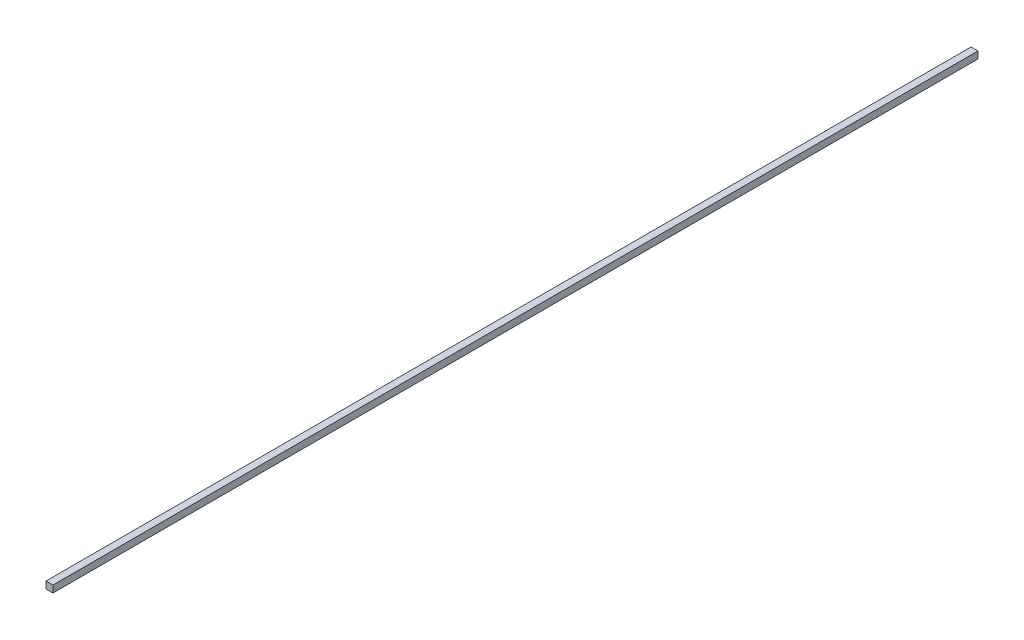
ISO-10303-21;
HEADER;
FILE_DESCRIPTION(('STEP AP214'),'2;1');
FILE_NAME('part.step','',(''),(''),'','','');
FILE_SCHEMA(('AUTOMOTIVE_DESIGN { 1 0 10303 214 1 1 1 1 }'));
ENDSEC;
DATA;
#1=APPLICATION_CONTEXT('core data for automotive mechanical design processes');
#2=APPLICATION_PROTOCOL_DEFINITION('international standard','automotive_design',2000,#1);
#3=PRODUCT_CONTEXT('',#1,'mechanical');
#4=PRODUCT('Part','Part','',(#3));
#5=PRODUCT_RELATED_PRODUCT_CATEGORY('part','',(#4));
#6=PRODUCT_DEFINITION_FORMATION('','',#4);
#7=PRODUCT_DEFINITION_CONTEXT('part definition',#1,'design');
#8=PRODUCT_DEFINITION('design','',#6,#7);
#9=PRODUCT_DEFINITION_SHAPE('','',#8);
#10=(LENGTH_UNIT() NAMED_UNIT(*) SI_UNIT(.MILLI.,.METRE.));
#11=(NAMED_UNIT(*) PLANE_ANGLE_UNIT() SI_UNIT($,.RADIAN.));
#12=(NAMED_UNIT(*) SI_UNIT($,.STERADIAN.) SOLID_ANGLE_UNIT());
#13=UNCERTAINTY_MEASURE_WITH_UNIT(LENGTH_MEASURE(1.E-05),#10,'distance_accuracy_value','');
#14=(GEOMETRIC_REPRESENTATION_CONTEXT(3) GLOBAL_UNCERTAINTY_ASSIGNED_CONTEXT((#13)) GLOBAL_UNIT_ASSIGNED_CONTEXT((#10,
#11,#12)) REPRESENTATION_CONTEXT('',''));
#15=CARTESIAN_POINT('',(0.,0.,0.));
#16=DIRECTION('',(0.,0.,1.));
#17=DIRECTION('',(1.,0.,0.));
#18=AXIS2_PLACEMENT_3D('',#15,#16,#17);
#19=CARTESIAN_POINT('',(7.5,7.5,2000.));
#20=DIRECTION('',(-1.,0.,0.));
#21=DIRECTION('',(0.,-1.,0.));
#22=AXIS2_PLACEMENT_3D('',#19,#20,#21);
#23=PLANE('',#22);
#24=DIRECTION('',(0.,1.,0.));
#25=VECTOR('',#24,1.);
#26=CARTESIAN_POINT('',(7.5,7.5,0.));
#27=LINE('',#26,#25);
#28=CARTESIAN_POINT('',(7.5,-7.5,0.));
#29=VERTEX_POINT('',#28);
#30=CARTESIAN_POINT('',(7.5,7.5,0.));
#31=VERTEX_POINT('',#30);
#32=EDGE_CURVE('E96',#29,#31,#27,.T.);
#33=ORIENTED_EDGE('',*,*,#32,.T.);
#34=DIRECTION('',(0.,0.,-1.));
#35=VECTOR('',#34,1.);
#36=CARTESIAN_POINT('',(7.5,7.5,2000.));
#37=LINE('',#36,#35);
#38=CARTESIAN_POINT('',(7.5,7.5,2000.));
#39=VERTEX_POINT('',#38);
#40=EDGE_CURVE('E11',#39,#31,#37,.T.);
#41=ORIENTED_EDGE('',*,*,#40,.F.);
#42=DIRECTION('',(0.,1.,0.));
#43=VECTOR('',#42,1.);
#44=CARTESIAN_POINT('',(7.5,7.5,2000.));
#45=LINE('',#44,#43);
#46=CARTESIAN_POINT('',(7.5,-7.5,2000.));
#47=VERTEX_POINT('',#46);
#48=EDGE_CURVE('E84',#47,#39,#45,.T.);
#49=ORIENTED_EDGE('',*,*,#48,.F.);
#50=DIRECTION('',(0.,0.,-1.));
#51=VECTOR('',#50,1.);
#52=CARTESIAN_POINT('',(7.5,-7.5,2000.));
#53=LINE('',#52,#51);
#54=EDGE_CURVE('E92',#47,#29,#53,.T.);
#55=ORIENTED_EDGE('',*,*,#54,.T.);
#56=EDGE_LOOP('',(#33,#41,#49,#55));
#57=FACE_BOUND('',#56,.T.);
#58=ADVANCED_FACE('F33',(#57),#23,.F.);
#59=CARTESIAN_POINT('',(-7.5,7.5,2000.));
#60=DIRECTION('',(0.,-1.,0.));
#61=DIRECTION('',(0.,0.,-1.));
#62=AXIS2_PLACEMENT_3D('',#59,#60,#61);
#63=PLANE('',#62);
#64=DIRECTION('',(-1.,0.,0.));
#65=VECTOR('',#64,1.);
#66=CARTESIAN_POINT('',(-7.5,7.5,0.));
#67=LINE('',#66,#65);
#68=CARTESIAN_POINT('',(-7.5,7.5,0.));
#69=VERTEX_POINT('',#68);
#70=EDGE_CURVE('E88',#31,#69,#67,.T.);
#71=ORIENTED_EDGE('',*,*,#70,.T.);
#72=DIRECTION('',(0.,0.,-1.));
#73=VECTOR('',#72,1.);
#74=CARTESIAN_POINT('',(-7.5,7.5,2000.));
#75=LINE('',#74,#73);
#76=CARTESIAN_POINT('',(-7.5,7.5,2000.));
#77=VERTEX_POINT('',#76);
#78=EDGE_CURVE('E41',#77,#69,#75,.T.);
#79=ORIENTED_EDGE('',*,*,#78,.F.);
#80=DIRECTION('',(-1.,0.,0.));
#81=VECTOR('',#80,1.);
#82=CARTESIAN_POINT('',(-7.5,7.5,2000.));
#83=LINE('',#82,#81);
#84=EDGE_CURVE('E79',#39,#77,#83,.T.);
#85=ORIENTED_EDGE('',*,*,#84,.F.);
#86=ORIENTED_EDGE('',*,*,#40,.T.);
#87=EDGE_LOOP('',(#71,#79,#85,#86));
#88=FACE_BOUND('',#87,.T.);
#89=ADVANCED_FACE('F87',(#88),#63,.F.);
#90=CARTESIAN_POINT('',(-7.5,7.5,2000.));
#91=DIRECTION('',(1.,0.,0.));
#92=DIRECTION('',(0.,1.,0.));
#93=AXIS2_PLACEMENT_3D('',#90,#91,#92);
#94=PLANE('',#93);
#95=DIRECTION('',(0.,-1.,0.));
#96=VECTOR('',#95,1.);
#97=CARTESIAN_POINT('',(-7.5,7.5,0.));
#98=LINE('',#97,#96);
#99=CARTESIAN_POINT('',(-7.5,-7.5,0.));
#100=VERTEX_POINT('',#99);
#101=EDGE_CURVE('E66',#69,#100,#98,.T.);
#102=ORIENTED_EDGE('',*,*,#101,.T.);
#103=DIRECTION('',(0.,0.,-1.));
#104=VECTOR('',#103,1.);
#105=CARTESIAN_POINT('',(-7.5,-7.5,2000.));
#106=LINE('',#105,#104);
#107=CARTESIAN_POINT('',(-7.5,-7.5,2000.));
#108=VERTEX_POINT('',#107);
#109=EDGE_CURVE('E89',#108,#100,#106,.T.);
#110=ORIENTED_EDGE('',*,*,#109,.F.);
#111=DIRECTION('',(0.,-1.,0.));
#112=VECTOR('',#111,1.);
#113=CARTESIAN_POINT('',(-7.5,7.5,2000.));
#114=LINE('',#113,#112);
#115=EDGE_CURVE('E82',#77,#108,#114,.T.);
#116=ORIENTED_EDGE('',*,*,#115,.F.);
#117=ORIENTED_EDGE('',*,*,#78,.T.);
#118=EDGE_LOOP('',(#102,#110,#116,#117));
#119=FACE_BOUND('',#118,.T.);
#120=ADVANCED_FACE('F90',(#119),#94,.F.);
#121=CARTESIAN_POINT('',(-7.5,-7.5,2000.));
#122=DIRECTION('',(0.,1.,0.));
#123=DIRECTION('',(0.,0.,1.));
#124=AXIS2_PLACEMENT_3D('',#121,#122,#123);
#125=PLANE('',#124);
#126=DIRECTION('',(1.,0.,0.));
#127=VECTOR('',#126,1.);
#128=CARTESIAN_POINT('',(-7.5,-7.5,0.));
#129=LINE('',#128,#127);
#130=EDGE_CURVE('E72',#100,#29,#129,.T.);
#131=ORIENTED_EDGE('',*,*,#130,.T.);
#132=ORIENTED_EDGE('',*,*,#54,.F.);
#133=DIRECTION('',(1.,0.,0.));
#134=VECTOR('',#133,1.);
#135=CARTESIAN_POINT('',(-7.5,-7.5,2000.));
#136=LINE('',#135,#134);
#137=EDGE_CURVE('E49',#108,#47,#136,.T.);
#138=ORIENTED_EDGE('',*,*,#137,.F.);
#139=ORIENTED_EDGE('',*,*,#109,.T.);
#140=EDGE_LOOP('',(#131,#132,#138,#139));
#141=FACE_BOUND('',#140,.T.);
#142=ADVANCED_FACE('F103',(#141),#125,.F.);
#143=CARTESIAN_POINT('',(0.,0.,2000.));
#144=DIRECTION('',(0.,0.,1.));
#145=DIRECTION('',(1.,0.,0.));
#146=AXIS2_PLACEMENT_3D('',#143,#144,#145);
#147=PLANE('',#146);
#148=ORIENTED_EDGE('',*,*,#48,.T.);
#149=ORIENTED_EDGE('',*,*,#84,.T.);
#150=ORIENTED_EDGE('',*,*,#115,.T.);
#151=ORIENTED_EDGE('',*,*,#137,.T.);
#152=EDGE_LOOP('',(#148,#149,#150,#151));
#153=FACE_BOUND('',#152,.T.);
#154=ADVANCED_FACE('F80',(#153),#147,.T.);
#155=CARTESIAN_POINT('',(0.,0.,0.));
#156=DIRECTION('',(0.,0.,1.));
#157=DIRECTION('',(1.,0.,0.));
#158=AXIS2_PLACEMENT_3D('',#155,#156,#157);
#159=PLANE('',#158);
#160=ORIENTED_EDGE('',*,*,#32,.F.);
#161=ORIENTED_EDGE('',*,*,#130,.F.);
#162=ORIENTED_EDGE('',*,*,#101,.F.);
#163=ORIENTED_EDGE('',*,*,#70,.F.);
#164=EDGE_LOOP('',(#160,#161,#162,#163));
#165=FACE_BOUND('',#164,.T.);
#166=ADVANCED_FACE('F106',(#165),#159,.F.);
#167=CLOSED_SHELL('',(#58,#89,#120,#142,#154,#166));
#168=MANIFOLD_SOLID_BREP('B2',#167);
#169=ADVANCED_BREP_SHAPE_REPRESENTATION('',(#18,#168),#14);
#170=SHAPE_DEFINITION_REPRESENTATION(#9,#169);
ENDSEC;
END-ISO-10303-21;
